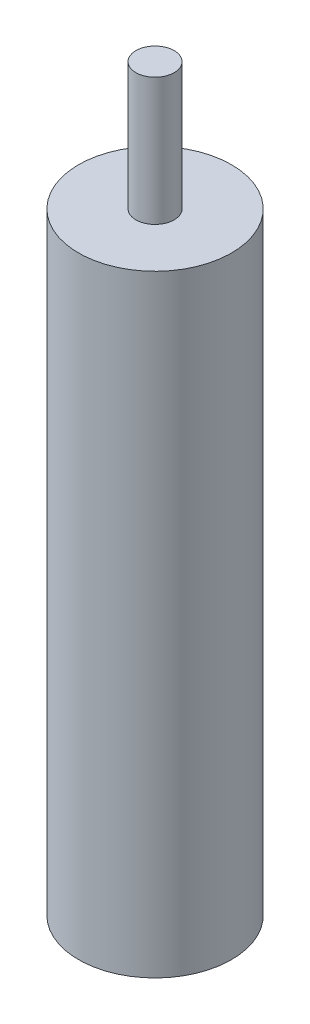
ISO-10303-21;
HEADER;
FILE_DESCRIPTION(('STEP AP214'),'2;1');
FILE_NAME('part.step','',(''),(''),'','','');
FILE_SCHEMA(('AUTOMOTIVE_DESIGN { 1 0 10303 214 1 1 1 1 }'));
ENDSEC;
DATA;
#1=APPLICATION_CONTEXT('core data for automotive mechanical design processes');
#2=APPLICATION_PROTOCOL_DEFINITION('international standard','automotive_design',2000,#1);
#3=PRODUCT_CONTEXT('',#1,'mechanical');
#4=PRODUCT('Part','Part','',(#3));
#5=PRODUCT_RELATED_PRODUCT_CATEGORY('part','',(#4));
#6=PRODUCT_DEFINITION_FORMATION('','',#4);
#7=PRODUCT_DEFINITION_CONTEXT('part definition',#1,'design');
#8=PRODUCT_DEFINITION('design','',#6,#7);
#9=PRODUCT_DEFINITION_SHAPE('','',#8);
#10=(LENGTH_UNIT() NAMED_UNIT(*) SI_UNIT(.MILLI.,.METRE.));
#11=(NAMED_UNIT(*) PLANE_ANGLE_UNIT() SI_UNIT($,.RADIAN.));
#12=(NAMED_UNIT(*) SI_UNIT($,.STERADIAN.) SOLID_ANGLE_UNIT());
#13=UNCERTAINTY_MEASURE_WITH_UNIT(LENGTH_MEASURE(1.E-05),#10,'distance_accuracy_value','');
#14=(GEOMETRIC_REPRESENTATION_CONTEXT(3) GLOBAL_UNCERTAINTY_ASSIGNED_CONTEXT((#13)) GLOBAL_UNIT_ASSIGNED_CONTEXT((#10,
#11,#12)) REPRESENTATION_CONTEXT('',''));
#15=CARTESIAN_POINT('',(0.,0.,0.));
#16=DIRECTION('',(0.,0.,1.));
#17=DIRECTION('',(1.,0.,0.));
#18=AXIS2_PLACEMENT_3D('',#15,#16,#17);
#19=CARTESIAN_POINT('',(0.,8.48029170027458,0.));
#20=DIRECTION('',(0.,1.,0.));
#21=DIRECTION('',(0.,0.,1.));
#22=AXIS2_PLACEMENT_3D('',#19,#20,#21);
#23=CYLINDRICAL_SURFACE('',#22,1.25);
#24=CARTESIAN_POINT('',(0.,8.48029170027458,0.));
#25=DIRECTION('',(0.,1.,0.));
#26=DIRECTION('',(0.,0.,1.));
#27=AXIS2_PLACEMENT_3D('',#24,#25,#26);
#28=CIRCLE('',#27,1.25);
#29=CARTESIAN_POINT('',(0.,8.48029170027458,1.25));
#30=VERTEX_POINT('',#29);
#31=EDGE_CURVE('E40',#30,#30,#28,.T.);
#32=ORIENTED_EDGE('',*,*,#31,.T.);
#33=EDGE_LOOP('',(#32));
#34=FACE_BOUND('',#33,.T.);
#35=CARTESIAN_POINT('',(0.,16.8136242002746,0.));
#36=DIRECTION('',(0.,1.,0.));
#37=DIRECTION('',(0.,0.,1.));
#38=AXIS2_PLACEMENT_3D('',#35,#36,#37);
#39=CIRCLE('',#38,1.25);
#40=CARTESIAN_POINT('',(0.,16.8136242002746,1.25));
#41=VERTEX_POINT('',#40);
#42=EDGE_CURVE('E10',#41,#41,#39,.T.);
#43=ORIENTED_EDGE('',*,*,#42,.F.);
#44=EDGE_LOOP('',(#43));
#45=FACE_BOUND('',#44,.T.);
#46=ADVANCED_FACE('F34',(#34,#45),#23,.T.);
#47=CARTESIAN_POINT('',(0.,16.8136242002746,0.));
#48=DIRECTION('',(0.,1.,0.));
#49=DIRECTION('',(0.,0.,1.));
#50=AXIS2_PLACEMENT_3D('',#47,#48,#49);
#51=PLANE('',#50);
#52=ORIENTED_EDGE('',*,*,#42,.T.);
#53=EDGE_LOOP('',(#52));
#54=FACE_BOUND('',#53,.T.);
#55=ADVANCED_FACE('F68',(#54),#51,.T.);
#56=CARTESIAN_POINT('',(0.,-31.5197082997254,0.));
#57=DIRECTION('',(0.,1.,0.));
#58=DIRECTION('',(0.,0.,1.));
#59=AXIS2_PLACEMENT_3D('',#56,#57,#58);
#60=CYLINDRICAL_SURFACE('',#59,5.);
#61=CARTESIAN_POINT('',(0.,-31.5197082997254,0.));
#62=DIRECTION('',(0.,-1.,0.));
#63=DIRECTION('',(0.,0.,-1.));
#64=AXIS2_PLACEMENT_3D('',#61,#62,#63);
#65=CIRCLE('',#64,5.);
#66=CARTESIAN_POINT('',(0.,-31.5197082997254,-5.));
#67=VERTEX_POINT('',#66);
#68=EDGE_CURVE('E44',#67,#67,#65,.T.);
#69=ORIENTED_EDGE('',*,*,#68,.F.);
#70=EDGE_LOOP('',(#69));
#71=FACE_BOUND('',#70,.T.);
#72=CARTESIAN_POINT('',(0.,8.48029170027458,0.));
#73=DIRECTION('',(0.,-1.,0.));
#74=DIRECTION('',(0.,0.,-1.));
#75=AXIS2_PLACEMENT_3D('',#72,#73,#74);
#76=CIRCLE('',#75,5.);
#77=CARTESIAN_POINT('',(0.,8.48029170027458,-5.));
#78=VERTEX_POINT('',#77);
#79=EDGE_CURVE('E48',#78,#78,#76,.T.);
#80=ORIENTED_EDGE('',*,*,#79,.T.);
#81=EDGE_LOOP('',(#80));
#82=FACE_BOUND('',#81,.T.);
#83=ADVANCED_FACE('F54',(#71,#82),#60,.T.);
#84=CARTESIAN_POINT('',(0.,-31.5197082997254,0.));
#85=DIRECTION('',(0.,-1.,0.));
#86=DIRECTION('',(0.,0.,-1.));
#87=AXIS2_PLACEMENT_3D('',#84,#85,#86);
#88=PLANE('',#87);
#89=ORIENTED_EDGE('',*,*,#68,.T.);
#90=EDGE_LOOP('',(#89));
#91=FACE_BOUND('',#90,.T.);
#92=ADVANCED_FACE('F58',(#91),#88,.T.);
#93=CARTESIAN_POINT('',(0.,8.48029170027458,0.));
#94=DIRECTION('',(0.,-1.,0.));
#95=DIRECTION('',(0.,0.,-1.));
#96=AXIS2_PLACEMENT_3D('',#93,#94,#95);
#97=PLANE('',#96);
#98=ORIENTED_EDGE('',*,*,#31,.F.);
#99=EDGE_LOOP('',(#98));
#100=FACE_BOUND('',#99,.T.);
#101=ORIENTED_EDGE('',*,*,#79,.F.);
#102=EDGE_LOOP('',(#101));
#103=FACE_BOUND('',#102,.T.);
#104=ADVANCED_FACE('F56',(#100,#103),#97,.F.);
#105=CLOSED_SHELL('',(#46,#55,#83,#92,#104));
#106=MANIFOLD_SOLID_BREP('B2',#105);
#107=ADVANCED_BREP_SHAPE_REPRESENTATION('',(#18,#106),#14);
#108=SHAPE_DEFINITION_REPRESENTATION(#9,#107);
ENDSEC;
END-ISO-10303-21;
